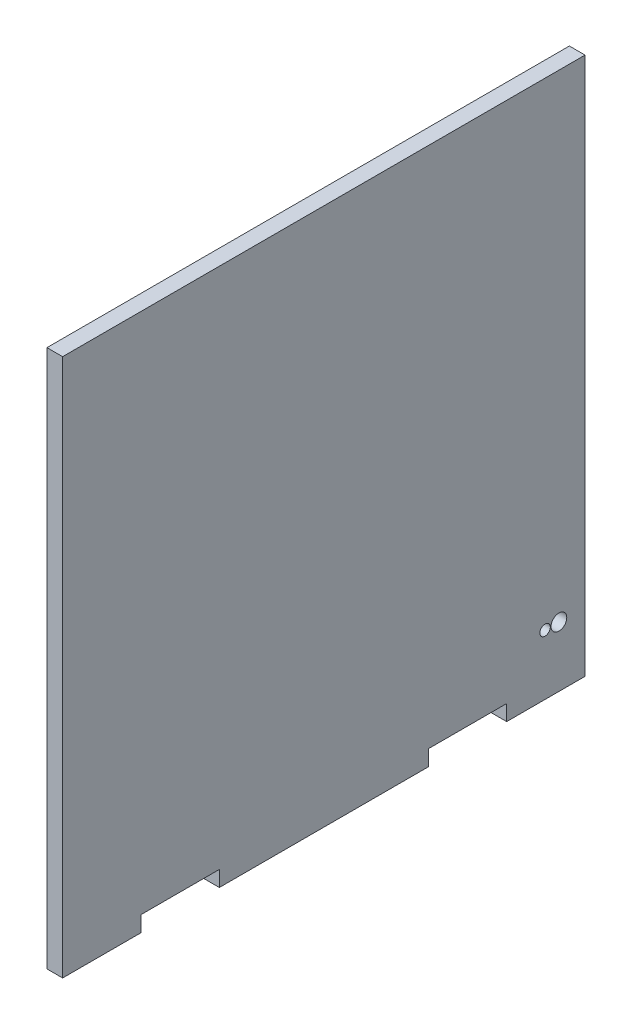
ISO-10303-21;
HEADER;
FILE_DESCRIPTION(('STEP AP214'),'2;1');
FILE_NAME('part.step','',(''),(''),'','','');
FILE_SCHEMA(('AUTOMOTIVE_DESIGN { 1 0 10303 214 1 1 1 1 }'));
ENDSEC;
DATA;
#1=APPLICATION_CONTEXT('core data for automotive mechanical design processes');
#2=APPLICATION_PROTOCOL_DEFINITION('international standard','automotive_design',2000,#1);
#3=PRODUCT_CONTEXT('',#1,'mechanical');
#4=PRODUCT('Part','Part','',(#3));
#5=PRODUCT_RELATED_PRODUCT_CATEGORY('part','',(#4));
#6=PRODUCT_DEFINITION_FORMATION('','',#4);
#7=PRODUCT_DEFINITION_CONTEXT('part definition',#1,'design');
#8=PRODUCT_DEFINITION('design','',#6,#7);
#9=PRODUCT_DEFINITION_SHAPE('','',#8);
#10=(LENGTH_UNIT() NAMED_UNIT(*) SI_UNIT(.MILLI.,.METRE.));
#11=(NAMED_UNIT(*) PLANE_ANGLE_UNIT() SI_UNIT($,.RADIAN.));
#12=(NAMED_UNIT(*) SI_UNIT($,.STERADIAN.) SOLID_ANGLE_UNIT());
#13=UNCERTAINTY_MEASURE_WITH_UNIT(LENGTH_MEASURE(1.E-05),#10,'distance_accuracy_value','');
#14=(GEOMETRIC_REPRESENTATION_CONTEXT(3) GLOBAL_UNCERTAINTY_ASSIGNED_CONTEXT((#13)) GLOBAL_UNIT_ASSIGNED_CONTEXT((#10,
#11,#12)) REPRESENTATION_CONTEXT('',''));
#15=CARTESIAN_POINT('',(0.,0.,0.));
#16=DIRECTION('',(0.,0.,1.));
#17=DIRECTION('',(1.,0.,0.));
#18=AXIS2_PLACEMENT_3D('',#15,#16,#17);
#19=CARTESIAN_POINT('',(6.,-103.,-40.));
#20=DIRECTION('',(0.,0.,1.));
#21=DIRECTION('',(1.,0.,0.));
#22=AXIS2_PLACEMENT_3D('',#19,#20,#21);
#23=PLANE('',#22);
#24=DIRECTION('',(0.,1.,0.));
#25=VECTOR('',#24,1.);
#26=CARTESIAN_POINT('',(0.,-103.,-40.));
#27=LINE('',#26,#25);
#28=CARTESIAN_POINT('',(0.,-103.,-40.));
#29=VERTEX_POINT('',#28);
#30=CARTESIAN_POINT('',(0.,-97.,-40.));
#31=VERTEX_POINT('',#30);
#32=EDGE_CURVE('E170',#29,#31,#27,.T.);
#33=ORIENTED_EDGE('',*,*,#32,.T.);
#34=DIRECTION('',(-1.,0.,0.));
#35=VECTOR('',#34,1.);
#36=CARTESIAN_POINT('',(6.,-97.,-40.));
#37=LINE('',#36,#35);
#38=CARTESIAN_POINT('',(6.,-97.,-40.));
#39=VERTEX_POINT('',#38);
#40=EDGE_CURVE('E11',#39,#31,#37,.T.);
#41=ORIENTED_EDGE('',*,*,#40,.F.);
#42=DIRECTION('',(0.,1.,0.));
#43=VECTOR('',#42,1.);
#44=CARTESIAN_POINT('',(6.,-103.,-40.));
#45=LINE('',#44,#43);
#46=CARTESIAN_POINT('',(6.,-103.,-40.));
#47=VERTEX_POINT('',#46);
#48=EDGE_CURVE('E212',#47,#39,#45,.T.);
#49=ORIENTED_EDGE('',*,*,#48,.F.);
#50=DIRECTION('',(-1.,0.,0.));
#51=VECTOR('',#50,1.);
#52=CARTESIAN_POINT('',(6.,-103.,-40.));
#53=LINE('',#52,#51);
#54=EDGE_CURVE('E166',#47,#29,#53,.T.);
#55=ORIENTED_EDGE('',*,*,#54,.T.);
#56=EDGE_LOOP('',(#33,#41,#49,#55));
#57=FACE_BOUND('',#56,.T.);
#58=ADVANCED_FACE('F45',(#57),#23,.F.);
#59=CARTESIAN_POINT('',(6.,-97.,-40.));
#60=DIRECTION('',(0.,1.,0.));
#61=DIRECTION('',(0.,0.,1.));
#62=AXIS2_PLACEMENT_3D('',#59,#60,#61);
#63=PLANE('',#62);
#64=DIRECTION('',(0.,0.,-1.));
#65=VECTOR('',#64,1.);
#66=CARTESIAN_POINT('',(0.,-97.,-40.));
#67=LINE('',#66,#65);
#68=CARTESIAN_POINT('',(0.,-97.,-70.));
#69=VERTEX_POINT('',#68);
#70=EDGE_CURVE('E174',#31,#69,#67,.T.);
#71=ORIENTED_EDGE('',*,*,#70,.T.);
#72=DIRECTION('',(-1.,0.,0.));
#73=VECTOR('',#72,1.);
#74=CARTESIAN_POINT('',(6.,-97.,-70.));
#75=LINE('',#74,#73);
#76=CARTESIAN_POINT('',(6.,-97.,-70.));
#77=VERTEX_POINT('',#76);
#78=EDGE_CURVE('E54',#77,#69,#75,.T.);
#79=ORIENTED_EDGE('',*,*,#78,.F.);
#80=DIRECTION('',(0.,0.,-1.));
#81=VECTOR('',#80,1.);
#82=CARTESIAN_POINT('',(6.,-97.,-40.));
#83=LINE('',#82,#81);
#84=EDGE_CURVE('E113',#39,#77,#83,.T.);
#85=ORIENTED_EDGE('',*,*,#84,.F.);
#86=ORIENTED_EDGE('',*,*,#40,.T.);
#87=EDGE_LOOP('',(#71,#79,#85,#86));
#88=FACE_BOUND('',#87,.T.);
#89=ADVANCED_FACE('F244',(#88),#63,.F.);
#90=CARTESIAN_POINT('',(6.,-103.,-70.));
#91=DIRECTION('',(0.,0.,1.));
#92=DIRECTION('',(1.,0.,0.));
#93=AXIS2_PLACEMENT_3D('',#90,#91,#92);
#94=PLANE('',#93);
#95=DIRECTION('',(0.,1.,0.));
#96=VECTOR('',#95,1.);
#97=CARTESIAN_POINT('',(0.,-103.,-70.));
#98=LINE('',#97,#96);
#99=CARTESIAN_POINT('',(0.,-103.,-70.));
#100=VERTEX_POINT('',#99);
#101=EDGE_CURVE('E179',#100,#69,#98,.T.);
#102=ORIENTED_EDGE('',*,*,#101,.F.);
#103=DIRECTION('',(-1.,0.,0.));
#104=VECTOR('',#103,1.);
#105=CARTESIAN_POINT('',(6.,-103.,-70.));
#106=LINE('',#105,#104);
#107=CARTESIAN_POINT('',(6.,-103.,-70.));
#108=VERTEX_POINT('',#107);
#109=EDGE_CURVE('E235',#108,#100,#106,.T.);
#110=ORIENTED_EDGE('',*,*,#109,.F.);
#111=DIRECTION('',(0.,1.,0.));
#112=VECTOR('',#111,1.);
#113=CARTESIAN_POINT('',(6.,-103.,-70.));
#114=LINE('',#113,#112);
#115=EDGE_CURVE('E243',#108,#77,#114,.T.);
#116=ORIENTED_EDGE('',*,*,#115,.T.);
#117=ORIENTED_EDGE('',*,*,#78,.T.);
#118=EDGE_LOOP('',(#102,#110,#116,#117));
#119=FACE_BOUND('',#118,.T.);
#120=ADVANCED_FACE('F241',(#119),#94,.T.);
#121=CARTESIAN_POINT('',(6.,-103.,-70.));
#122=DIRECTION('',(0.,1.,0.));
#123=DIRECTION('',(0.,0.,1.));
#124=AXIS2_PLACEMENT_3D('',#121,#122,#123);
#125=PLANE('',#124);
#126=DIRECTION('',(0.,0.,-1.));
#127=VECTOR('',#126,1.);
#128=CARTESIAN_POINT('',(0.,-103.,-70.));
#129=LINE('',#128,#127);
#130=CARTESIAN_POINT('',(0.,-103.,-100.));
#131=VERTEX_POINT('',#130);
#132=EDGE_CURVE('E183',#100,#131,#129,.T.);
#133=ORIENTED_EDGE('',*,*,#132,.T.);
#134=DIRECTION('',(-1.,0.,0.));
#135=VECTOR('',#134,1.);
#136=CARTESIAN_POINT('',(6.,-103.,-100.));
#137=LINE('',#136,#135);
#138=CARTESIAN_POINT('',(6.,-103.,-100.));
#139=VERTEX_POINT('',#138);
#140=EDGE_CURVE('E231',#139,#131,#137,.T.);
#141=ORIENTED_EDGE('',*,*,#140,.F.);
#142=DIRECTION('',(0.,0.,-1.));
#143=VECTOR('',#142,1.);
#144=CARTESIAN_POINT('',(6.,-103.,-70.));
#145=LINE('',#144,#143);
#146=EDGE_CURVE('E264',#108,#139,#145,.T.);
#147=ORIENTED_EDGE('',*,*,#146,.F.);
#148=ORIENTED_EDGE('',*,*,#109,.T.);
#149=EDGE_LOOP('',(#133,#141,#147,#148));
#150=FACE_BOUND('',#149,.T.);
#151=ADVANCED_FACE('F253',(#150),#125,.F.);
#152=CARTESIAN_POINT('',(6.,-103.,-100.));
#153=DIRECTION('',(0.,0.,1.));
#154=DIRECTION('',(1.,0.,0.));
#155=AXIS2_PLACEMENT_3D('',#152,#153,#154);
#156=PLANE('',#155);
#157=DIRECTION('',(0.,1.,0.));
#158=VECTOR('',#157,1.);
#159=CARTESIAN_POINT('',(0.,-103.,-100.));
#160=LINE('',#159,#158);
#161=CARTESIAN_POINT('',(0.,103.,-100.));
#162=VERTEX_POINT('',#161);
#163=EDGE_CURVE('E186',#131,#162,#160,.T.);
#164=ORIENTED_EDGE('',*,*,#163,.T.);
#165=DIRECTION('',(-1.,0.,0.));
#166=VECTOR('',#165,1.);
#167=CARTESIAN_POINT('',(6.,103.,-100.));
#168=LINE('',#167,#166);
#169=CARTESIAN_POINT('',(6.,103.,-100.));
#170=VERTEX_POINT('',#169);
#171=EDGE_CURVE('E228',#170,#162,#168,.T.);
#172=ORIENTED_EDGE('',*,*,#171,.F.);
#173=DIRECTION('',(0.,1.,0.));
#174=VECTOR('',#173,1.);
#175=CARTESIAN_POINT('',(6.,-103.,-100.));
#176=LINE('',#175,#174);
#177=EDGE_CURVE('E259',#139,#170,#176,.T.);
#178=ORIENTED_EDGE('',*,*,#177,.F.);
#179=ORIENTED_EDGE('',*,*,#140,.T.);
#180=EDGE_LOOP('',(#164,#172,#178,#179));
#181=FACE_BOUND('',#180,.T.);
#182=ADVANCED_FACE('F257',(#181),#156,.F.);
#183=CARTESIAN_POINT('',(6.,103.,100.));
#184=DIRECTION('',(0.,1.,0.));
#185=DIRECTION('',(0.,0.,1.));
#186=AXIS2_PLACEMENT_3D('',#183,#184,#185);
#187=PLANE('',#186);
#188=DIRECTION('',(0.,0.,-1.));
#189=VECTOR('',#188,1.);
#190=CARTESIAN_POINT('',(0.,103.,100.));
#191=LINE('',#190,#189);
#192=CARTESIAN_POINT('',(0.,103.,100.));
#193=VERTEX_POINT('',#192);
#194=EDGE_CURVE('E190',#193,#162,#191,.T.);
#195=ORIENTED_EDGE('',*,*,#194,.F.);
#196=DIRECTION('',(-1.,0.,0.));
#197=VECTOR('',#196,1.);
#198=CARTESIAN_POINT('',(6.,103.,100.));
#199=LINE('',#198,#197);
#200=CARTESIAN_POINT('',(6.,103.,100.));
#201=VERTEX_POINT('',#200);
#202=EDGE_CURVE('E225',#201,#193,#199,.T.);
#203=ORIENTED_EDGE('',*,*,#202,.F.);
#204=DIRECTION('',(0.,0.,-1.));
#205=VECTOR('',#204,1.);
#206=CARTESIAN_POINT('',(6.,103.,100.));
#207=LINE('',#206,#205);
#208=EDGE_CURVE('E263',#201,#170,#207,.T.);
#209=ORIENTED_EDGE('',*,*,#208,.T.);
#210=ORIENTED_EDGE('',*,*,#171,.T.);
#211=EDGE_LOOP('',(#195,#203,#209,#210));
#212=FACE_BOUND('',#211,.T.);
#213=ADVANCED_FACE('F407',(#212),#187,.T.);
#214=CARTESIAN_POINT('',(6.,-103.,100.));
#215=DIRECTION('',(0.,0.,1.));
#216=DIRECTION('',(1.,0.,0.));
#217=AXIS2_PLACEMENT_3D('',#214,#215,#216);
#218=PLANE('',#217);
#219=DIRECTION('',(0.,1.,0.));
#220=VECTOR('',#219,1.);
#221=CARTESIAN_POINT('',(0.,-103.,100.));
#222=LINE('',#221,#220);
#223=CARTESIAN_POINT('',(0.,-103.,100.));
#224=VERTEX_POINT('',#223);
#225=EDGE_CURVE('E194',#224,#193,#222,.T.);
#226=ORIENTED_EDGE('',*,*,#225,.F.);
#227=DIRECTION('',(-1.,0.,0.));
#228=VECTOR('',#227,1.);
#229=CARTESIAN_POINT('',(6.,-103.,100.));
#230=LINE('',#229,#228);
#231=CARTESIAN_POINT('',(6.,-103.,100.));
#232=VERTEX_POINT('',#231);
#233=EDGE_CURVE('E222',#232,#224,#230,.T.);
#234=ORIENTED_EDGE('',*,*,#233,.F.);
#235=DIRECTION('',(0.,1.,0.));
#236=VECTOR('',#235,1.);
#237=CARTESIAN_POINT('',(6.,-103.,100.));
#238=LINE('',#237,#236);
#239=EDGE_CURVE('E268',#232,#201,#238,.T.);
#240=ORIENTED_EDGE('',*,*,#239,.T.);
#241=ORIENTED_EDGE('',*,*,#202,.T.);
#242=EDGE_LOOP('',(#226,#234,#240,#241));
#243=FACE_BOUND('',#242,.T.);
#244=ADVANCED_FACE('F286',(#243),#218,.T.);
#245=CARTESIAN_POINT('',(6.,-103.,70.));
#246=DIRECTION('',(0.,-1.,0.));
#247=DIRECTION('',(0.,0.,-1.));
#248=AXIS2_PLACEMENT_3D('',#245,#246,#247);
#249=PLANE('',#248);
#250=DIRECTION('',(0.,0.,1.));
#251=VECTOR('',#250,1.);
#252=CARTESIAN_POINT('',(0.,-103.,70.));
#253=LINE('',#252,#251);
#254=CARTESIAN_POINT('',(0.,-103.,70.));
#255=VERTEX_POINT('',#254);
#256=EDGE_CURVE('E198',#255,#224,#253,.T.);
#257=ORIENTED_EDGE('',*,*,#256,.F.);
#258=DIRECTION('',(-1.,0.,0.));
#259=VECTOR('',#258,1.);
#260=CARTESIAN_POINT('',(6.,-103.,70.));
#261=LINE('',#260,#259);
#262=CARTESIAN_POINT('',(6.,-103.,70.));
#263=VERTEX_POINT('',#262);
#264=EDGE_CURVE('E219',#263,#255,#261,.T.);
#265=ORIENTED_EDGE('',*,*,#264,.F.);
#266=DIRECTION('',(0.,0.,1.));
#267=VECTOR('',#266,1.);
#268=CARTESIAN_POINT('',(6.,-103.,70.));
#269=LINE('',#268,#267);
#270=EDGE_CURVE('E276',#263,#232,#269,.T.);
#271=ORIENTED_EDGE('',*,*,#270,.T.);
#272=ORIENTED_EDGE('',*,*,#233,.T.);
#273=EDGE_LOOP('',(#257,#265,#271,#272));
#274=FACE_BOUND('',#273,.T.);
#275=ADVANCED_FACE('F282',(#274),#249,.T.);
#276=CARTESIAN_POINT('',(6.,-103.,70.));
#277=DIRECTION('',(0.,0.,1.));
#278=DIRECTION('',(1.,0.,0.));
#279=AXIS2_PLACEMENT_3D('',#276,#277,#278);
#280=PLANE('',#279);
#281=DIRECTION('',(0.,1.,0.));
#282=VECTOR('',#281,1.);
#283=CARTESIAN_POINT('',(0.,-103.,70.));
#284=LINE('',#283,#282);
#285=CARTESIAN_POINT('',(0.,-97.,70.));
#286=VERTEX_POINT('',#285);
#287=EDGE_CURVE('E202',#255,#286,#284,.T.);
#288=ORIENTED_EDGE('',*,*,#287,.T.);
#289=DIRECTION('',(-1.,0.,0.));
#290=VECTOR('',#289,1.);
#291=CARTESIAN_POINT('',(6.,-97.,70.));
#292=LINE('',#291,#290);
#293=CARTESIAN_POINT('',(6.,-97.,70.));
#294=VERTEX_POINT('',#293);
#295=EDGE_CURVE('E160',#294,#286,#292,.T.);
#296=ORIENTED_EDGE('',*,*,#295,.F.);
#297=DIRECTION('',(0.,1.,0.));
#298=VECTOR('',#297,1.);
#299=CARTESIAN_POINT('',(6.,-103.,70.));
#300=LINE('',#299,#298);
#301=EDGE_CURVE('E145',#263,#294,#300,.T.);
#302=ORIENTED_EDGE('',*,*,#301,.F.);
#303=ORIENTED_EDGE('',*,*,#264,.T.);
#304=EDGE_LOOP('',(#288,#296,#302,#303));
#305=FACE_BOUND('',#304,.T.);
#306=ADVANCED_FACE('F290',(#305),#280,.F.);
#307=CARTESIAN_POINT('',(6.,-97.,70.));
#308=DIRECTION('',(0.,1.,0.));
#309=DIRECTION('',(0.,0.,1.));
#310=AXIS2_PLACEMENT_3D('',#307,#308,#309);
#311=PLANE('',#310);
#312=DIRECTION('',(0.,0.,-1.));
#313=VECTOR('',#312,1.);
#314=CARTESIAN_POINT('',(0.,-97.,70.));
#315=LINE('',#314,#313);
#316=CARTESIAN_POINT('',(0.,-97.,40.));
#317=VERTEX_POINT('',#316);
#318=EDGE_CURVE('E155',#286,#317,#315,.T.);
#319=ORIENTED_EDGE('',*,*,#318,.T.);
#320=DIRECTION('',(-1.,0.,0.));
#321=VECTOR('',#320,1.);
#322=CARTESIAN_POINT('',(6.,-97.,40.));
#323=LINE('',#322,#321);
#324=CARTESIAN_POINT('',(6.,-97.,40.));
#325=VERTEX_POINT('',#324);
#326=EDGE_CURVE('E152',#325,#317,#323,.T.);
#327=ORIENTED_EDGE('',*,*,#326,.F.);
#328=DIRECTION('',(0.,0.,-1.));
#329=VECTOR('',#328,1.);
#330=CARTESIAN_POINT('',(6.,-97.,70.));
#331=LINE('',#330,#329);
#332=EDGE_CURVE('E138',#294,#325,#331,.T.);
#333=ORIENTED_EDGE('',*,*,#332,.F.);
#334=ORIENTED_EDGE('',*,*,#295,.T.);
#335=EDGE_LOOP('',(#319,#327,#333,#334));
#336=FACE_BOUND('',#335,.T.);
#337=ADVANCED_FACE('F153',(#336),#311,.F.);
#338=CARTESIAN_POINT('',(6.,-103.,40.));
#339=DIRECTION('',(0.,0.,1.));
#340=DIRECTION('',(1.,0.,0.));
#341=AXIS2_PLACEMENT_3D('',#338,#339,#340);
#342=PLANE('',#341);
#343=DIRECTION('',(0.,1.,0.));
#344=VECTOR('',#343,1.);
#345=CARTESIAN_POINT('',(0.,-103.,40.));
#346=LINE('',#345,#344);
#347=CARTESIAN_POINT('',(0.,-103.,40.));
#348=VERTEX_POINT('',#347);
#349=EDGE_CURVE('E207',#348,#317,#346,.T.);
#350=ORIENTED_EDGE('',*,*,#349,.F.);
#351=DIRECTION('',(-1.,0.,0.));
#352=VECTOR('',#351,1.);
#353=CARTESIAN_POINT('',(6.,-103.,40.));
#354=LINE('',#353,#352);
#355=CARTESIAN_POINT('',(6.,-103.,40.));
#356=VERTEX_POINT('',#355);
#357=EDGE_CURVE('E102',#356,#348,#354,.T.);
#358=ORIENTED_EDGE('',*,*,#357,.F.);
#359=DIRECTION('',(0.,1.,0.));
#360=VECTOR('',#359,1.);
#361=CARTESIAN_POINT('',(6.,-103.,40.));
#362=LINE('',#361,#360);
#363=EDGE_CURVE('E142',#356,#325,#362,.T.);
#364=ORIENTED_EDGE('',*,*,#363,.T.);
#365=ORIENTED_EDGE('',*,*,#326,.T.);
#366=EDGE_LOOP('',(#350,#358,#364,#365));
#367=FACE_BOUND('',#366,.T.);
#368=ADVANCED_FACE('F162',(#367),#342,.T.);
#369=CARTESIAN_POINT('',(6.,-103.,40.));
#370=DIRECTION('',(0.,1.,0.));
#371=DIRECTION('',(0.,0.,1.));
#372=AXIS2_PLACEMENT_3D('',#369,#370,#371);
#373=PLANE('',#372);
#374=DIRECTION('',(0.,0.,-1.));
#375=VECTOR('',#374,1.);
#376=CARTESIAN_POINT('',(0.,-103.,40.));
#377=LINE('',#376,#375);
#378=EDGE_CURVE('E105',#348,#29,#377,.T.);
#379=ORIENTED_EDGE('',*,*,#378,.T.);
#380=ORIENTED_EDGE('',*,*,#54,.F.);
#381=DIRECTION('',(0.,0.,-1.));
#382=VECTOR('',#381,1.);
#383=CARTESIAN_POINT('',(6.,-103.,40.));
#384=LINE('',#383,#382);
#385=EDGE_CURVE('E62',#356,#47,#384,.T.);
#386=ORIENTED_EDGE('',*,*,#385,.F.);
#387=ORIENTED_EDGE('',*,*,#357,.T.);
#388=EDGE_LOOP('',(#379,#380,#386,#387));
#389=FACE_BOUND('',#388,.T.);
#390=ADVANCED_FACE('F305',(#389),#373,.F.);
#391=CARTESIAN_POINT('',(6.,0.,0.));
#392=DIRECTION('',(-1.,0.,0.));
#393=DIRECTION('',(0.,0.,1.));
#394=AXIS2_PLACEMENT_3D('',#391,#392,#393);
#395=PLANE('',#394);
#396=CARTESIAN_POINT('',(6.,-80.,-90.));
#397=DIRECTION('',(1.,0.,0.));
#398=DIRECTION('',(0.,0.,-1.));
#399=AXIS2_PLACEMENT_3D('',#396,#397,#398);
#400=CIRCLE('',#399,3.00000000000001);
#401=CARTESIAN_POINT('',(6.,-80.,-93.));
#402=VERTEX_POINT('',#401);
#403=EDGE_CURVE('E333',#402,#402,#400,.T.);
#404=ORIENTED_EDGE('',*,*,#403,.F.);
#405=EDGE_LOOP('',(#404));
#406=FACE_BOUND('',#405,.T.);
#407=CARTESIAN_POINT('',(6.,-80.,-84.7));
#408=DIRECTION('',(1.,0.,0.));
#409=DIRECTION('',(0.,0.,-1.));
#410=AXIS2_PLACEMENT_3D('',#407,#408,#409);
#411=CIRCLE('',#410,2.);
#412=CARTESIAN_POINT('',(6.,-80.,-86.7));
#413=VERTEX_POINT('',#412);
#414=EDGE_CURVE('E335',#413,#413,#411,.T.);
#415=ORIENTED_EDGE('',*,*,#414,.F.);
#416=EDGE_LOOP('',(#415));
#417=FACE_BOUND('',#416,.T.);
#418=ORIENTED_EDGE('',*,*,#48,.T.);
#419=ORIENTED_EDGE('',*,*,#84,.T.);
#420=ORIENTED_EDGE('',*,*,#115,.F.);
#421=ORIENTED_EDGE('',*,*,#146,.T.);
#422=ORIENTED_EDGE('',*,*,#177,.T.);
#423=ORIENTED_EDGE('',*,*,#208,.F.);
#424=ORIENTED_EDGE('',*,*,#239,.F.);
#425=ORIENTED_EDGE('',*,*,#270,.F.);
#426=ORIENTED_EDGE('',*,*,#301,.T.);
#427=ORIENTED_EDGE('',*,*,#332,.T.);
#428=ORIENTED_EDGE('',*,*,#363,.F.);
#429=ORIENTED_EDGE('',*,*,#385,.T.);
#430=EDGE_LOOP('',(#418,#419,#420,#421,#422,#423,#424,#425,#426,#427,#428,#429));
#431=FACE_BOUND('',#430,.T.);
#432=ADVANCED_FACE('F140',(#406,#417,#431),#395,.F.);
#433=CARTESIAN_POINT('',(0.,0.,0.));
#434=DIRECTION('',(-1.,0.,0.));
#435=DIRECTION('',(0.,0.,1.));
#436=AXIS2_PLACEMENT_3D('',#433,#434,#435);
#437=PLANE('',#436);
#438=CARTESIAN_POINT('',(0.,-80.,-90.));
#439=DIRECTION('',(1.,0.,0.));
#440=DIRECTION('',(0.,0.,-1.));
#441=AXIS2_PLACEMENT_3D('',#438,#439,#440);
#442=CIRCLE('',#441,3.00000000000001);
#443=CARTESIAN_POINT('',(0.,-80.,-93.));
#444=VERTEX_POINT('',#443);
#445=EDGE_CURVE('E175',#444,#444,#442,.T.);
#446=ORIENTED_EDGE('',*,*,#445,.T.);
#447=EDGE_LOOP('',(#446));
#448=FACE_BOUND('',#447,.T.);
#449=CARTESIAN_POINT('',(0.,-80.,-84.7));
#450=DIRECTION('',(1.,0.,0.));
#451=DIRECTION('',(0.,0.,-1.));
#452=AXIS2_PLACEMENT_3D('',#449,#450,#451);
#453=CIRCLE('',#452,2.);
#454=CARTESIAN_POINT('',(0.,-80.,-86.7));
#455=VERTEX_POINT('',#454);
#456=EDGE_CURVE('E341',#455,#455,#453,.T.);
#457=ORIENTED_EDGE('',*,*,#456,.T.);
#458=EDGE_LOOP('',(#457));
#459=FACE_BOUND('',#458,.T.);
#460=ORIENTED_EDGE('',*,*,#32,.F.);
#461=ORIENTED_EDGE('',*,*,#378,.F.);
#462=ORIENTED_EDGE('',*,*,#349,.T.);
#463=ORIENTED_EDGE('',*,*,#318,.F.);
#464=ORIENTED_EDGE('',*,*,#287,.F.);
#465=ORIENTED_EDGE('',*,*,#256,.T.);
#466=ORIENTED_EDGE('',*,*,#225,.T.);
#467=ORIENTED_EDGE('',*,*,#194,.T.);
#468=ORIENTED_EDGE('',*,*,#163,.F.);
#469=ORIENTED_EDGE('',*,*,#132,.F.);
#470=ORIENTED_EDGE('',*,*,#101,.T.);
#471=ORIENTED_EDGE('',*,*,#70,.F.);
#472=EDGE_LOOP('',(#460,#461,#462,#463,#464,#465,#466,#467,#468,#469,#470,#471));
#473=FACE_BOUND('',#472,.T.);
#474=ADVANCED_FACE('F249',(#448,#459,#473),#437,.T.);
#475=CARTESIAN_POINT('',(0.,-80.,-84.7));
#476=DIRECTION('',(1.,0.,0.));
#477=DIRECTION('',(0.,0.,-1.));
#478=AXIS2_PLACEMENT_3D('',#475,#476,#477);
#479=CYLINDRICAL_SURFACE('',#478,2.);
#480=ORIENTED_EDGE('',*,*,#456,.F.);
#481=EDGE_LOOP('',(#480));
#482=FACE_BOUND('',#481,.T.);
#483=ORIENTED_EDGE('',*,*,#414,.T.);
#484=EDGE_LOOP('',(#483));
#485=FACE_BOUND('',#484,.T.);
#486=ADVANCED_FACE('F317',(#482,#485),#479,.F.);
#487=CARTESIAN_POINT('',(0.,-80.,-90.));
#488=DIRECTION('',(1.,0.,0.));
#489=DIRECTION('',(0.,0.,-1.));
#490=AXIS2_PLACEMENT_3D('',#487,#488,#489);
#491=CYLINDRICAL_SURFACE('',#490,3.00000000000001);
#492=ORIENTED_EDGE('',*,*,#445,.F.);
#493=EDGE_LOOP('',(#492));
#494=FACE_BOUND('',#493,.T.);
#495=ORIENTED_EDGE('',*,*,#403,.T.);
#496=EDGE_LOOP('',(#495));
#497=FACE_BOUND('',#496,.T.);
#498=ADVANCED_FACE('F322',(#494,#497),#491,.F.);
#499=CLOSED_SHELL('',(#58,#89,#120,#151,#182,#213,#244,#275,#306,#337,#368,#390,#432,#474,#486,#498));
#500=MANIFOLD_SOLID_BREP('B2',#499);
#501=ADVANCED_BREP_SHAPE_REPRESENTATION('',(#18,#500),#14);
#502=SHAPE_DEFINITION_REPRESENTATION(#9,#501);
ENDSEC;
END-ISO-10303-21;
